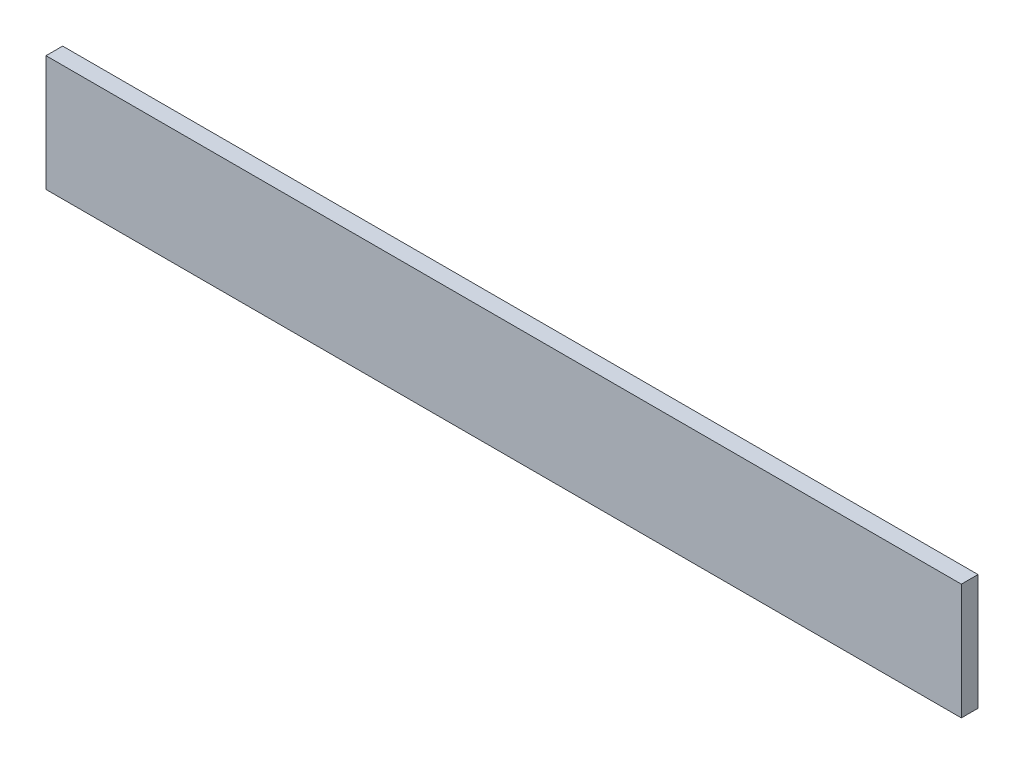
ISO-10303-21;
HEADER;
FILE_DESCRIPTION(('STEP AP214'),'2;1');
FILE_NAME('part.step','',(''),(''),'','','');
FILE_SCHEMA(('AUTOMOTIVE_DESIGN { 1 0 10303 214 1 1 1 1 }'));
ENDSEC;
DATA;
#1=APPLICATION_CONTEXT('core data for automotive mechanical design processes');
#2=APPLICATION_PROTOCOL_DEFINITION('international standard','automotive_design',2000,#1);
#3=PRODUCT_CONTEXT('',#1,'mechanical');
#4=PRODUCT('Part','Part','',(#3));
#5=PRODUCT_RELATED_PRODUCT_CATEGORY('part','',(#4));
#6=PRODUCT_DEFINITION_FORMATION('','',#4);
#7=PRODUCT_DEFINITION_CONTEXT('part definition',#1,'design');
#8=PRODUCT_DEFINITION('design','',#6,#7);
#9=PRODUCT_DEFINITION_SHAPE('','',#8);
#10=(LENGTH_UNIT() NAMED_UNIT(*) SI_UNIT(.MILLI.,.METRE.));
#11=(NAMED_UNIT(*) PLANE_ANGLE_UNIT() SI_UNIT($,.RADIAN.));
#12=(NAMED_UNIT(*) SI_UNIT($,.STERADIAN.) SOLID_ANGLE_UNIT());
#13=UNCERTAINTY_MEASURE_WITH_UNIT(LENGTH_MEASURE(1.E-05),#10,'distance_accuracy_value','');
#14=(GEOMETRIC_REPRESENTATION_CONTEXT(3) GLOBAL_UNCERTAINTY_ASSIGNED_CONTEXT((#13)) GLOBAL_UNIT_ASSIGNED_CONTEXT((#10,
#11,#12)) REPRESENTATION_CONTEXT('',''));
#15=CARTESIAN_POINT('',(0.,0.,0.));
#16=DIRECTION('',(0.,0.,1.));
#17=DIRECTION('',(1.,0.,0.));
#18=AXIS2_PLACEMENT_3D('',#15,#16,#17);
#19=CARTESIAN_POINT('',(501.65,63.5,18.25625));
#20=DIRECTION('',(-1.,0.,0.));
#21=DIRECTION('',(0.,0.,1.));
#22=AXIS2_PLACEMENT_3D('',#19,#20,#21);
#23=PLANE('',#22);
#24=DIRECTION('',(0.,1.,0.));
#25=VECTOR('',#24,1.);
#26=CARTESIAN_POINT('',(501.65,63.5,0.));
#27=LINE('',#26,#25);
#28=CARTESIAN_POINT('',(501.65,-63.5,0.));
#29=VERTEX_POINT('',#28);
#30=CARTESIAN_POINT('',(501.65,63.5,0.));
#31=VERTEX_POINT('',#30);
#32=EDGE_CURVE('E96',#29,#31,#27,.T.);
#33=ORIENTED_EDGE('',*,*,#32,.T.);
#34=DIRECTION('',(0.,0.,-1.));
#35=VECTOR('',#34,1.);
#36=CARTESIAN_POINT('',(501.65,63.5,18.25625));
#37=LINE('',#36,#35);
#38=CARTESIAN_POINT('',(501.65,63.5,18.25625));
#39=VERTEX_POINT('',#38);
#40=EDGE_CURVE('E11',#39,#31,#37,.T.);
#41=ORIENTED_EDGE('',*,*,#40,.F.);
#42=DIRECTION('',(0.,1.,0.));
#43=VECTOR('',#42,1.);
#44=CARTESIAN_POINT('',(501.65,63.5,18.25625));
#45=LINE('',#44,#43);
#46=CARTESIAN_POINT('',(501.65,-63.5,18.25625));
#47=VERTEX_POINT('',#46);
#48=EDGE_CURVE('E84',#47,#39,#45,.T.);
#49=ORIENTED_EDGE('',*,*,#48,.F.);
#50=DIRECTION('',(0.,0.,-1.));
#51=VECTOR('',#50,1.);
#52=CARTESIAN_POINT('',(501.65,-63.5,18.25625));
#53=LINE('',#52,#51);
#54=EDGE_CURVE('E92',#47,#29,#53,.T.);
#55=ORIENTED_EDGE('',*,*,#54,.T.);
#56=EDGE_LOOP('',(#33,#41,#49,#55));
#57=FACE_BOUND('',#56,.T.);
#58=ADVANCED_FACE('F33',(#57),#23,.F.);
#59=CARTESIAN_POINT('',(-501.65,63.5,18.25625));
#60=DIRECTION('',(0.,-1.,0.));
#61=DIRECTION('',(0.,0.,-1.));
#62=AXIS2_PLACEMENT_3D('',#59,#60,#61);
#63=PLANE('',#62);
#64=DIRECTION('',(-1.,0.,0.));
#65=VECTOR('',#64,1.);
#66=CARTESIAN_POINT('',(-501.65,63.5,0.));
#67=LINE('',#66,#65);
#68=CARTESIAN_POINT('',(-501.65,63.5,0.));
#69=VERTEX_POINT('',#68);
#70=EDGE_CURVE('E88',#31,#69,#67,.T.);
#71=ORIENTED_EDGE('',*,*,#70,.T.);
#72=DIRECTION('',(0.,0.,-1.));
#73=VECTOR('',#72,1.);
#74=CARTESIAN_POINT('',(-501.65,63.5,18.25625));
#75=LINE('',#74,#73);
#76=CARTESIAN_POINT('',(-501.65,63.5,18.25625));
#77=VERTEX_POINT('',#76);
#78=EDGE_CURVE('E41',#77,#69,#75,.T.);
#79=ORIENTED_EDGE('',*,*,#78,.F.);
#80=DIRECTION('',(-1.,0.,0.));
#81=VECTOR('',#80,1.);
#82=CARTESIAN_POINT('',(-501.65,63.5,18.25625));
#83=LINE('',#82,#81);
#84=EDGE_CURVE('E79',#39,#77,#83,.T.);
#85=ORIENTED_EDGE('',*,*,#84,.F.);
#86=ORIENTED_EDGE('',*,*,#40,.T.);
#87=EDGE_LOOP('',(#71,#79,#85,#86));
#88=FACE_BOUND('',#87,.T.);
#89=ADVANCED_FACE('F87',(#88),#63,.F.);
#90=CARTESIAN_POINT('',(-501.65,63.5,18.25625));
#91=DIRECTION('',(1.,0.,0.));
#92=DIRECTION('',(0.,0.,-1.));
#93=AXIS2_PLACEMENT_3D('',#90,#91,#92);
#94=PLANE('',#93);
#95=DIRECTION('',(0.,-1.,0.));
#96=VECTOR('',#95,1.);
#97=CARTESIAN_POINT('',(-501.65,63.5,0.));
#98=LINE('',#97,#96);
#99=CARTESIAN_POINT('',(-501.65,-63.5,0.));
#100=VERTEX_POINT('',#99);
#101=EDGE_CURVE('E66',#69,#100,#98,.T.);
#102=ORIENTED_EDGE('',*,*,#101,.T.);
#103=DIRECTION('',(0.,0.,-1.));
#104=VECTOR('',#103,1.);
#105=CARTESIAN_POINT('',(-501.65,-63.5,18.25625));
#106=LINE('',#105,#104);
#107=CARTESIAN_POINT('',(-501.65,-63.5,18.25625));
#108=VERTEX_POINT('',#107);
#109=EDGE_CURVE('E89',#108,#100,#106,.T.);
#110=ORIENTED_EDGE('',*,*,#109,.F.);
#111=DIRECTION('',(0.,-1.,0.));
#112=VECTOR('',#111,1.);
#113=CARTESIAN_POINT('',(-501.65,63.5,18.25625));
#114=LINE('',#113,#112);
#115=EDGE_CURVE('E82',#77,#108,#114,.T.);
#116=ORIENTED_EDGE('',*,*,#115,.F.);
#117=ORIENTED_EDGE('',*,*,#78,.T.);
#118=EDGE_LOOP('',(#102,#110,#116,#117));
#119=FACE_BOUND('',#118,.T.);
#120=ADVANCED_FACE('F90',(#119),#94,.F.);
#121=CARTESIAN_POINT('',(-501.65,-63.5,18.25625));
#122=DIRECTION('',(0.,1.,0.));
#123=DIRECTION('',(0.,0.,1.));
#124=AXIS2_PLACEMENT_3D('',#121,#122,#123);
#125=PLANE('',#124);
#126=DIRECTION('',(1.,0.,0.));
#127=VECTOR('',#126,1.);
#128=CARTESIAN_POINT('',(-501.65,-63.5,0.));
#129=LINE('',#128,#127);
#130=EDGE_CURVE('E72',#100,#29,#129,.T.);
#131=ORIENTED_EDGE('',*,*,#130,.T.);
#132=ORIENTED_EDGE('',*,*,#54,.F.);
#133=DIRECTION('',(1.,0.,0.));
#134=VECTOR('',#133,1.);
#135=CARTESIAN_POINT('',(-501.65,-63.5,18.25625));
#136=LINE('',#135,#134);
#137=EDGE_CURVE('E49',#108,#47,#136,.T.);
#138=ORIENTED_EDGE('',*,*,#137,.F.);
#139=ORIENTED_EDGE('',*,*,#109,.T.);
#140=EDGE_LOOP('',(#131,#132,#138,#139));
#141=FACE_BOUND('',#140,.T.);
#142=ADVANCED_FACE('F103',(#141),#125,.F.);
#143=CARTESIAN_POINT('',(0.,0.,18.25625));
#144=DIRECTION('',(0.,0.,1.));
#145=DIRECTION('',(1.,0.,0.));
#146=AXIS2_PLACEMENT_3D('',#143,#144,#145);
#147=PLANE('',#146);
#148=ORIENTED_EDGE('',*,*,#48,.T.);
#149=ORIENTED_EDGE('',*,*,#84,.T.);
#150=ORIENTED_EDGE('',*,*,#115,.T.);
#151=ORIENTED_EDGE('',*,*,#137,.T.);
#152=EDGE_LOOP('',(#148,#149,#150,#151));
#153=FACE_BOUND('',#152,.T.);
#154=ADVANCED_FACE('F80',(#153),#147,.T.);
#155=CARTESIAN_POINT('',(0.,0.,0.));
#156=DIRECTION('',(0.,0.,1.));
#157=DIRECTION('',(1.,0.,0.));
#158=AXIS2_PLACEMENT_3D('',#155,#156,#157);
#159=PLANE('',#158);
#160=ORIENTED_EDGE('',*,*,#32,.F.);
#161=ORIENTED_EDGE('',*,*,#130,.F.);
#162=ORIENTED_EDGE('',*,*,#101,.F.);
#163=ORIENTED_EDGE('',*,*,#70,.F.);
#164=EDGE_LOOP('',(#160,#161,#162,#163));
#165=FACE_BOUND('',#164,.T.);
#166=ADVANCED_FACE('F106',(#165),#159,.F.);
#167=CLOSED_SHELL('',(#58,#89,#120,#142,#154,#166));
#168=MANIFOLD_SOLID_BREP('B2',#167);
#169=ADVANCED_BREP_SHAPE_REPRESENTATION('',(#18,#168),#14);
#170=SHAPE_DEFINITION_REPRESENTATION(#9,#169);
ENDSEC;
END-ISO-10303-21;
